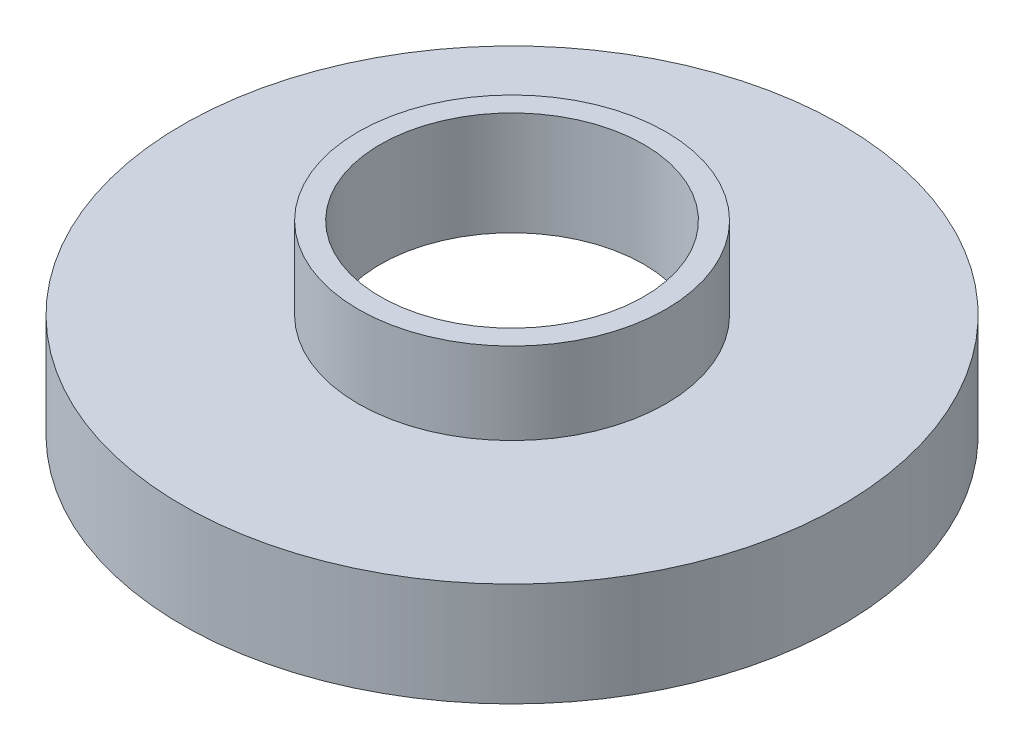
ISO-10303-21;
HEADER;
FILE_DESCRIPTION(('STEP AP214'),'2;1');
FILE_NAME('part.step','',(''),(''),'','','');
FILE_SCHEMA(('AUTOMOTIVE_DESIGN { 1 0 10303 214 1 1 1 1 }'));
ENDSEC;
DATA;
#1=APPLICATION_CONTEXT('core data for automotive mechanical design processes');
#2=APPLICATION_PROTOCOL_DEFINITION('international standard','automotive_design',2000,#1);
#3=PRODUCT_CONTEXT('',#1,'mechanical');
#4=PRODUCT('Part','Part','',(#3));
#5=PRODUCT_RELATED_PRODUCT_CATEGORY('part','',(#4));
#6=PRODUCT_DEFINITION_FORMATION('','',#4);
#7=PRODUCT_DEFINITION_CONTEXT('part definition',#1,'design');
#8=PRODUCT_DEFINITION('design','',#6,#7);
#9=PRODUCT_DEFINITION_SHAPE('','',#8);
#10=(LENGTH_UNIT() NAMED_UNIT(*) SI_UNIT(.MILLI.,.METRE.));
#11=(NAMED_UNIT(*) PLANE_ANGLE_UNIT() SI_UNIT($,.RADIAN.));
#12=(NAMED_UNIT(*) SI_UNIT($,.STERADIAN.) SOLID_ANGLE_UNIT());
#13=UNCERTAINTY_MEASURE_WITH_UNIT(LENGTH_MEASURE(1.E-05),#10,'distance_accuracy_value','');
#14=(GEOMETRIC_REPRESENTATION_CONTEXT(3) GLOBAL_UNCERTAINTY_ASSIGNED_CONTEXT((#13)) GLOBAL_UNIT_ASSIGNED_CONTEXT((#10,
#11,#12)) REPRESENTATION_CONTEXT('',''));
#15=CARTESIAN_POINT('',(0.,0.,0.));
#16=DIRECTION('',(0.,0.,1.));
#17=DIRECTION('',(1.,0.,0.));
#18=AXIS2_PLACEMENT_3D('',#15,#16,#17);
#19=CARTESIAN_POINT('',(22.225,26.825,0.));
#20=DIRECTION('',(0.,1.,0.));
#21=DIRECTION('',(0.,0.,1.));
#22=AXIS2_PLACEMENT_3D('',#19,#20,#21);
#23=PLANE('',#22);
#24=CARTESIAN_POINT('',(0.,26.825,0.));
#25=DIRECTION('',(0.,-1.,0.));
#26=DIRECTION('',(0.,0.,-1.));
#27=AXIS2_PLACEMENT_3D('',#24,#25,#26);
#28=CIRCLE('',#27,19.05);
#29=CARTESIAN_POINT('',(0.,26.825,-19.05));
#30=VERTEX_POINT('',#29);
#31=EDGE_CURVE('E10',#30,#30,#28,.T.);
#32=ORIENTED_EDGE('',*,*,#31,.T.);
#33=EDGE_LOOP('',(#32));
#34=FACE_BOUND('',#33,.T.);
#35=CARTESIAN_POINT('',(0.,26.825,0.));
#36=DIRECTION('',(0.,-1.,0.));
#37=DIRECTION('',(0.,0.,-1.));
#38=AXIS2_PLACEMENT_3D('',#35,#36,#37);
#39=CIRCLE('',#38,22.225);
#40=CARTESIAN_POINT('',(0.,26.825,-22.225));
#41=VERTEX_POINT('',#40);
#42=EDGE_CURVE('E62',#41,#41,#39,.T.);
#43=ORIENTED_EDGE('',*,*,#42,.F.);
#44=EDGE_LOOP('',(#43));
#45=FACE_BOUND('',#44,.T.);
#46=ADVANCED_FACE('F34',(#34,#45),#23,.T.);
#47=CARTESIAN_POINT('',(0.,0.,0.));
#48=DIRECTION('',(0.,-1.,0.));
#49=DIRECTION('',(0.,0.,-1.));
#50=AXIS2_PLACEMENT_3D('',#47,#48,#49);
#51=CYLINDRICAL_SURFACE('',#50,19.05);
#52=CARTESIAN_POINT('',(0.,11.825,0.));
#53=DIRECTION('',(0.,-1.,0.));
#54=DIRECTION('',(0.,0.,-1.));
#55=AXIS2_PLACEMENT_3D('',#52,#53,#54);
#56=CIRCLE('',#55,19.05);
#57=CARTESIAN_POINT('',(0.,11.825,-19.05));
#58=VERTEX_POINT('',#57);
#59=EDGE_CURVE('E40',#58,#58,#56,.T.);
#60=ORIENTED_EDGE('',*,*,#59,.T.);
#61=EDGE_LOOP('',(#60));
#62=FACE_BOUND('',#61,.T.);
#63=ORIENTED_EDGE('',*,*,#31,.F.);
#64=EDGE_LOOP('',(#63));
#65=FACE_BOUND('',#64,.T.);
#66=ADVANCED_FACE('F70',(#62,#65),#51,.F.);
#67=CARTESIAN_POINT('',(19.05,11.825,0.));
#68=DIRECTION('',(0.,-1.,0.));
#69=DIRECTION('',(0.,0.,-1.));
#70=AXIS2_PLACEMENT_3D('',#67,#68,#69);
#71=PLANE('',#70);
#72=CARTESIAN_POINT('',(0.,11.825,0.));
#73=DIRECTION('',(0.,-1.,0.));
#74=DIRECTION('',(0.,0.,-1.));
#75=AXIS2_PLACEMENT_3D('',#72,#73,#74);
#76=CIRCLE('',#75,44.45);
#77=CARTESIAN_POINT('',(0.,11.825,-44.45));
#78=VERTEX_POINT('',#77);
#79=EDGE_CURVE('E44',#78,#78,#76,.T.);
#80=ORIENTED_EDGE('',*,*,#79,.T.);
#81=EDGE_LOOP('',(#80));
#82=FACE_BOUND('',#81,.T.);
#83=ORIENTED_EDGE('',*,*,#59,.F.);
#84=EDGE_LOOP('',(#83));
#85=FACE_BOUND('',#84,.T.);
#86=ADVANCED_FACE('F74',(#82,#85),#71,.T.);
#87=CARTESIAN_POINT('',(0.,0.,0.));
#88=DIRECTION('',(0.,-1.,0.));
#89=DIRECTION('',(0.,0.,-1.));
#90=AXIS2_PLACEMENT_3D('',#87,#88,#89);
#91=CYLINDRICAL_SURFACE('',#90,44.45);
#92=CARTESIAN_POINT('',(0.,0.,0.));
#93=DIRECTION('',(0.,-1.,0.));
#94=DIRECTION('',(0.,0.,-1.));
#95=AXIS2_PLACEMENT_3D('',#92,#93,#94);
#96=CIRCLE('',#95,44.45);
#97=CARTESIAN_POINT('',(0.,0.,-44.45));
#98=VERTEX_POINT('',#97);
#99=EDGE_CURVE('E48',#98,#98,#96,.T.);
#100=ORIENTED_EDGE('',*,*,#99,.T.);
#101=EDGE_LOOP('',(#100));
#102=FACE_BOUND('',#101,.T.);
#103=ORIENTED_EDGE('',*,*,#79,.F.);
#104=EDGE_LOOP('',(#103));
#105=FACE_BOUND('',#104,.T.);
#106=ADVANCED_FACE('F78',(#102,#105),#91,.F.);
#107=CARTESIAN_POINT('',(44.45,0.,0.));
#108=DIRECTION('',(0.,-1.,0.));
#109=DIRECTION('',(0.,0.,-1.));
#110=AXIS2_PLACEMENT_3D('',#107,#108,#109);
#111=PLANE('',#110);
#112=CARTESIAN_POINT('',(0.,0.,0.));
#113=DIRECTION('',(0.,-1.,0.));
#114=DIRECTION('',(0.,0.,-1.));
#115=AXIS2_PLACEMENT_3D('',#112,#113,#114);
#116=CIRCLE('',#115,47.625);
#117=CARTESIAN_POINT('',(0.,0.,-47.625));
#118=VERTEX_POINT('',#117);
#119=EDGE_CURVE('E53',#118,#118,#116,.T.);
#120=ORIENTED_EDGE('',*,*,#119,.T.);
#121=EDGE_LOOP('',(#120));
#122=FACE_BOUND('',#121,.T.);
#123=ORIENTED_EDGE('',*,*,#99,.F.);
#124=EDGE_LOOP('',(#123));
#125=FACE_BOUND('',#124,.T.);
#126=ADVANCED_FACE('F85',(#122,#125),#111,.T.);
#127=CARTESIAN_POINT('',(0.,0.,0.));
#128=DIRECTION('',(0.,-1.,0.));
#129=DIRECTION('',(0.,0.,-1.));
#130=AXIS2_PLACEMENT_3D('',#127,#128,#129);
#131=CYLINDRICAL_SURFACE('',#130,47.625);
#132=CARTESIAN_POINT('',(0.,15.,0.));
#133=DIRECTION('',(0.,-1.,0.));
#134=DIRECTION('',(0.,0.,-1.));
#135=AXIS2_PLACEMENT_3D('',#132,#133,#134);
#136=CIRCLE('',#135,47.625);
#137=CARTESIAN_POINT('',(0.,15.,-47.625));
#138=VERTEX_POINT('',#137);
#139=EDGE_CURVE('E56',#138,#138,#136,.T.);
#140=ORIENTED_EDGE('',*,*,#139,.T.);
#141=EDGE_LOOP('',(#140));
#142=FACE_BOUND('',#141,.T.);
#143=ORIENTED_EDGE('',*,*,#119,.F.);
#144=EDGE_LOOP('',(#143));
#145=FACE_BOUND('',#144,.T.);
#146=ADVANCED_FACE('F89',(#142,#145),#131,.T.);
#147=CARTESIAN_POINT('',(47.625,15.,0.));
#148=DIRECTION('',(0.,1.,0.));
#149=DIRECTION('',(0.,0.,1.));
#150=AXIS2_PLACEMENT_3D('',#147,#148,#149);
#151=PLANE('',#150);
#152=CARTESIAN_POINT('',(0.,15.,0.));
#153=DIRECTION('',(0.,-1.,0.));
#154=DIRECTION('',(0.,0.,-1.));
#155=AXIS2_PLACEMENT_3D('',#152,#153,#154);
#156=CIRCLE('',#155,22.225);
#157=CARTESIAN_POINT('',(0.,15.,-22.225));
#158=VERTEX_POINT('',#157);
#159=EDGE_CURVE('E59',#158,#158,#156,.T.);
#160=ORIENTED_EDGE('',*,*,#159,.T.);
#161=EDGE_LOOP('',(#160));
#162=FACE_BOUND('',#161,.T.);
#163=ORIENTED_EDGE('',*,*,#139,.F.);
#164=EDGE_LOOP('',(#163));
#165=FACE_BOUND('',#164,.T.);
#166=ADVANCED_FACE('F93',(#162,#165),#151,.T.);
#167=CARTESIAN_POINT('',(0.,0.,0.));
#168=DIRECTION('',(0.,-1.,0.));
#169=DIRECTION('',(0.,0.,-1.));
#170=AXIS2_PLACEMENT_3D('',#167,#168,#169);
#171=CYLINDRICAL_SURFACE('',#170,22.225);
#172=ORIENTED_EDGE('',*,*,#42,.T.);
#173=EDGE_LOOP('',(#172));
#174=FACE_BOUND('',#173,.T.);
#175=ORIENTED_EDGE('',*,*,#159,.F.);
#176=EDGE_LOOP('',(#175));
#177=FACE_BOUND('',#176,.T.);
#178=ADVANCED_FACE('F66',(#174,#177),#171,.T.);
#179=CLOSED_SHELL('',(#46,#66,#86,#106,#126,#146,#166,#178));
#180=MANIFOLD_SOLID_BREP('B2',#179);
#181=ADVANCED_BREP_SHAPE_REPRESENTATION('',(#18,#180),#14);
#182=SHAPE_DEFINITION_REPRESENTATION(#9,#181);
ENDSEC;
END-ISO-10303-21;
